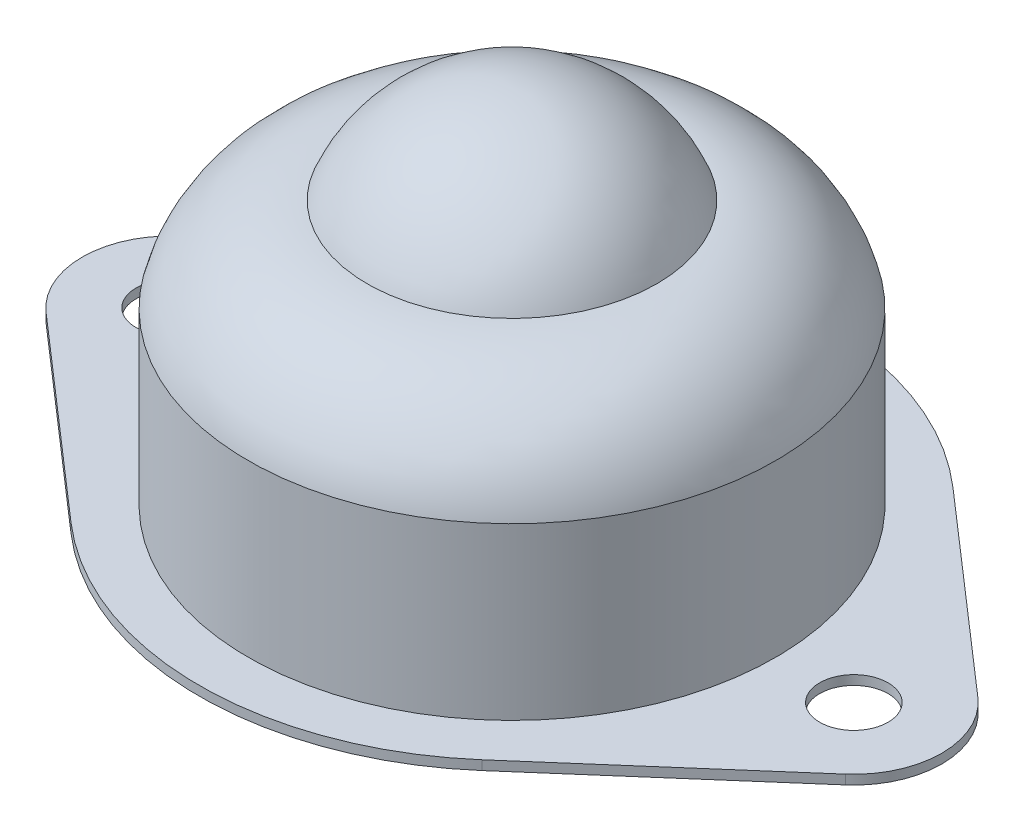
ISO-10303-21;
HEADER;
FILE_DESCRIPTION(('STEP AP214'),'2;1');
FILE_NAME('part.step','',(''),(''),'','','');
FILE_SCHEMA(('AUTOMOTIVE_DESIGN { 1 0 10303 214 1 1 1 1 }'));
ENDSEC;
DATA;
#1=APPLICATION_CONTEXT('core data for automotive mechanical design processes');
#2=APPLICATION_PROTOCOL_DEFINITION('international standard','automotive_design',2000,#1);
#3=PRODUCT_CONTEXT('',#1,'mechanical');
#4=PRODUCT('Part','Part','',(#3));
#5=PRODUCT_RELATED_PRODUCT_CATEGORY('part','',(#4));
#6=PRODUCT_DEFINITION_FORMATION('','',#4);
#7=PRODUCT_DEFINITION_CONTEXT('part definition',#1,'design');
#8=PRODUCT_DEFINITION('design','',#6,#7);
#9=PRODUCT_DEFINITION_SHAPE('','',#8);
#10=(LENGTH_UNIT() NAMED_UNIT(*) SI_UNIT(.MILLI.,.METRE.));
#11=(NAMED_UNIT(*) PLANE_ANGLE_UNIT() SI_UNIT($,.RADIAN.));
#12=(NAMED_UNIT(*) SI_UNIT($,.STERADIAN.) SOLID_ANGLE_UNIT());
#13=UNCERTAINTY_MEASURE_WITH_UNIT(LENGTH_MEASURE(1.E-05),#10,'distance_accuracy_value','');
#14=(GEOMETRIC_REPRESENTATION_CONTEXT(3) GLOBAL_UNCERTAINTY_ASSIGNED_CONTEXT((#13)) GLOBAL_UNIT_ASSIGNED_CONTEXT((#10,
#11,#12)) REPRESENTATION_CONTEXT('',''));
#15=CARTESIAN_POINT('',(0.,0.,0.));
#16=DIRECTION('',(0.,0.,1.));
#17=DIRECTION('',(1.,0.,0.));
#18=AXIS2_PLACEMENT_3D('',#15,#16,#17);
#19=CARTESIAN_POINT('',(0.,0.762,0.));
#20=DIRECTION('',(0.,-1.,0.));
#21=DIRECTION('',(0.,0.,-1.));
#22=AXIS2_PLACEMENT_3D('',#19,#20,#21);
#23=PLANE('',#22);
#24=CARTESIAN_POINT('',(0.,0.762,0.));
#25=DIRECTION('',(0.,-1.,0.));
#26=DIRECTION('',(0.,0.,-1.));
#27=AXIS2_PLACEMENT_3D('',#24,#25,#26);
#28=CIRCLE('',#27,21.43125);
#29=CARTESIAN_POINT('',(0.,0.762,-21.43125));
#30=VERTEX_POINT('',#29);
#31=EDGE_CURVE('E187',#30,#30,#28,.T.);
#32=ORIENTED_EDGE('',*,*,#31,.T.);
#33=EDGE_LOOP('',(#32));
#34=FACE_BOUND('',#33,.T.);
#35=CARTESIAN_POINT('',(-27.78125,0.762,0.));
#36=DIRECTION('',(0.,1.,0.));
#37=DIRECTION('',(0.,0.,1.));
#38=AXIS2_PLACEMENT_3D('',#35,#36,#37);
#39=CIRCLE('',#38,2.778125);
#40=CARTESIAN_POINT('',(-27.78125,0.762,-2.778125));
#41=VERTEX_POINT('',#40);
#42=EDGE_CURVE('E133',#41,#41,#39,.T.);
#43=ORIENTED_EDGE('',*,*,#42,.F.);
#44=EDGE_LOOP('',(#43));
#45=FACE_BOUND('',#44,.T.);
#46=CARTESIAN_POINT('',(0.,0.762,0.));
#47=DIRECTION('',(0.,1.,0.));
#48=DIRECTION('',(0.,0.,-1.));
#49=AXIS2_PLACEMENT_3D('',#46,#47,#48);
#50=CIRCLE('',#49,25.4);
#51=CARTESIAN_POINT('',(16.6914285714286,0.762,-19.1456577908647));
#52=VERTEX_POINT('',#51);
#53=CARTESIAN_POINT('',(-16.6914285714286,0.762,-19.1456577908647));
#54=VERTEX_POINT('',#53);
#55=EDGE_CURVE('E144',#52,#54,#50,.T.);
#56=ORIENTED_EDGE('',*,*,#55,.T.);
#57=DIRECTION('',(-0.753766054758452,0.,0.657142857142857));
#58=VECTOR('',#57,1.);
#59=CARTESIAN_POINT('',(-16.6914285714286,0.762,-19.1456577908647));
#60=LINE('',#59,#58);
#61=CARTESIAN_POINT('',(-32.4757142857143,0.762,-5.38471625368069));
#62=VERTEX_POINT('',#61);
#63=EDGE_CURVE('E92',#54,#62,#60,.T.);
#64=ORIENTED_EDGE('',*,*,#63,.T.);
#65=CARTESIAN_POINT('',(-27.78125,0.762,0.));
#66=DIRECTION('',(0.,1.,0.));
#67=DIRECTION('',(0.,0.,-1.));
#68=AXIS2_PLACEMENT_3D('',#65,#66,#67);
#69=CIRCLE('',#68,7.14375);
#70=CARTESIAN_POINT('',(-32.4757142857143,0.762,5.38471625368069));
#71=VERTEX_POINT('',#70);
#72=EDGE_CURVE('E159',#62,#71,#69,.T.);
#73=ORIENTED_EDGE('',*,*,#72,.T.);
#74=DIRECTION('',(0.753766054758453,0.,0.657142857142857));
#75=VECTOR('',#74,1.);
#76=CARTESIAN_POINT('',(-16.6914285714286,0.762,19.1456577908647));
#77=LINE('',#76,#75);
#78=CARTESIAN_POINT('',(-16.6914285714286,0.762,19.1456577908647));
#79=VERTEX_POINT('',#78);
#80=EDGE_CURVE('E172',#71,#79,#77,.T.);
#81=ORIENTED_EDGE('',*,*,#80,.T.);
#82=CARTESIAN_POINT('',(0.,0.762,0.));
#83=DIRECTION('',(0.,1.,0.));
#84=DIRECTION('',(0.,0.,1.));
#85=AXIS2_PLACEMENT_3D('',#82,#83,#84);
#86=CIRCLE('',#85,25.4);
#87=CARTESIAN_POINT('',(16.6914285714286,0.762,19.1456577908647));
#88=VERTEX_POINT('',#87);
#89=EDGE_CURVE('E111',#79,#88,#86,.T.);
#90=ORIENTED_EDGE('',*,*,#89,.T.);
#91=DIRECTION('',(0.753766054758453,0.,-0.657142857142857));
#92=VECTOR('',#91,1.);
#93=CARTESIAN_POINT('',(16.6914285714286,0.762,19.1456577908647));
#94=LINE('',#93,#92);
#95=CARTESIAN_POINT('',(32.4757142857143,0.762,5.38471625368069));
#96=VERTEX_POINT('',#95);
#97=EDGE_CURVE('E105',#88,#96,#94,.T.);
#98=ORIENTED_EDGE('',*,*,#97,.T.);
#99=CARTESIAN_POINT('',(27.78125,0.762,0.));
#100=DIRECTION('',(0.,1.,0.));
#101=DIRECTION('',(0.,0.,-1.));
#102=AXIS2_PLACEMENT_3D('',#99,#100,#101);
#103=CIRCLE('',#102,7.14375);
#104=CARTESIAN_POINT('',(32.4757142857143,0.762,-5.38471625368069));
#105=VERTEX_POINT('',#104);
#106=EDGE_CURVE('E109',#96,#105,#103,.T.);
#107=ORIENTED_EDGE('',*,*,#106,.T.);
#108=DIRECTION('',(-0.753766054758453,0.,-0.657142857142857));
#109=VECTOR('',#108,1.);
#110=CARTESIAN_POINT('',(16.6914285714286,0.762,-19.1456577908647));
#111=LINE('',#110,#109);
#112=EDGE_CURVE('E49',#105,#52,#111,.T.);
#113=ORIENTED_EDGE('',*,*,#112,.T.);
#114=EDGE_LOOP('',(#56,#64,#73,#81,#90,#98,#107,#113));
#115=FACE_BOUND('',#114,.T.);
#116=CARTESIAN_POINT('',(27.78125,0.762,0.));
#117=DIRECTION('',(0.,1.,0.));
#118=DIRECTION('',(0.,0.,1.));
#119=AXIS2_PLACEMENT_3D('',#116,#117,#118);
#120=CIRCLE('',#119,2.778125);
#121=CARTESIAN_POINT('',(27.78125,0.762,-2.778125));
#122=VERTEX_POINT('',#121);
#123=EDGE_CURVE('E181',#122,#122,#120,.T.);
#124=ORIENTED_EDGE('',*,*,#123,.F.);
#125=EDGE_LOOP('',(#124));
#126=FACE_BOUND('',#125,.T.);
#127=ADVANCED_FACE('F32',(#34,#45,#115,#126),#23,.F.);
#128=CARTESIAN_POINT('',(0.,0.,0.));
#129=DIRECTION('',(0.,-1.,0.));
#130=DIRECTION('',(0.,0.,-1.));
#131=AXIS2_PLACEMENT_3D('',#128,#129,#130);
#132=PLANE('',#131);
#133=CARTESIAN_POINT('',(-27.78125,0.,0.));
#134=DIRECTION('',(0.,1.,0.));
#135=DIRECTION('',(0.,0.,1.));
#136=AXIS2_PLACEMENT_3D('',#133,#134,#135);
#137=CIRCLE('',#136,2.778125);
#138=CARTESIAN_POINT('',(-27.78125,0.,-2.778125));
#139=VERTEX_POINT('',#138);
#140=EDGE_CURVE('E178',#139,#139,#137,.T.);
#141=ORIENTED_EDGE('',*,*,#140,.T.);
#142=EDGE_LOOP('',(#141));
#143=FACE_BOUND('',#142,.T.);
#144=CARTESIAN_POINT('',(0.,0.,0.));
#145=DIRECTION('',(0.,1.,0.));
#146=DIRECTION('',(0.,0.,-1.));
#147=AXIS2_PLACEMENT_3D('',#144,#145,#146);
#148=CIRCLE('',#147,25.4);
#149=CARTESIAN_POINT('',(16.6914285714286,0.,-19.1456577908647));
#150=VERTEX_POINT('',#149);
#151=CARTESIAN_POINT('',(-16.6914285714286,0.,-19.1456577908647));
#152=VERTEX_POINT('',#151);
#153=EDGE_CURVE('E129',#150,#152,#148,.T.);
#154=ORIENTED_EDGE('',*,*,#153,.F.);
#155=DIRECTION('',(-0.753766054758453,0.,-0.657142857142857));
#156=VECTOR('',#155,1.);
#157=CARTESIAN_POINT('',(16.6914285714286,0.,-19.1456577908647));
#158=LINE('',#157,#156);
#159=CARTESIAN_POINT('',(32.4757142857143,0.,-5.38471625368069));
#160=VERTEX_POINT('',#159);
#161=EDGE_CURVE('E84',#160,#150,#158,.T.);
#162=ORIENTED_EDGE('',*,*,#161,.F.);
#163=CARTESIAN_POINT('',(27.78125,0.,0.));
#164=DIRECTION('',(0.,1.,0.));
#165=DIRECTION('',(0.,0.,-1.));
#166=AXIS2_PLACEMENT_3D('',#163,#164,#165);
#167=CIRCLE('',#166,7.14375);
#168=CARTESIAN_POINT('',(32.4757142857143,0.,5.38471625368069));
#169=VERTEX_POINT('',#168);
#170=EDGE_CURVE('E78',#169,#160,#167,.T.);
#171=ORIENTED_EDGE('',*,*,#170,.F.);
#172=DIRECTION('',(0.753766054758453,0.,-0.657142857142857));
#173=VECTOR('',#172,1.);
#174=CARTESIAN_POINT('',(16.6914285714286,0.,19.1456577908647));
#175=LINE('',#174,#173);
#176=CARTESIAN_POINT('',(16.6914285714286,0.,19.1456577908647));
#177=VERTEX_POINT('',#176);
#178=EDGE_CURVE('E119',#177,#169,#175,.T.);
#179=ORIENTED_EDGE('',*,*,#178,.F.);
#180=CARTESIAN_POINT('',(0.,0.,0.));
#181=DIRECTION('',(0.,1.,0.));
#182=DIRECTION('',(0.,0.,1.));
#183=AXIS2_PLACEMENT_3D('',#180,#181,#182);
#184=CIRCLE('',#183,25.4);
#185=CARTESIAN_POINT('',(-16.6914285714286,0.,19.1456577908647));
#186=VERTEX_POINT('',#185);
#187=EDGE_CURVE('E139',#186,#177,#184,.T.);
#188=ORIENTED_EDGE('',*,*,#187,.F.);
#189=DIRECTION('',(0.753766054758453,0.,0.657142857142857));
#190=VECTOR('',#189,1.);
#191=CARTESIAN_POINT('',(-16.6914285714286,0.,19.1456577908647));
#192=LINE('',#191,#190);
#193=CARTESIAN_POINT('',(-32.4757142857143,0.,5.38471625368069));
#194=VERTEX_POINT('',#193);
#195=EDGE_CURVE('E137',#194,#186,#192,.T.);
#196=ORIENTED_EDGE('',*,*,#195,.F.);
#197=CARTESIAN_POINT('',(-27.78125,0.,0.));
#198=DIRECTION('',(0.,1.,0.));
#199=DIRECTION('',(0.,0.,-1.));
#200=AXIS2_PLACEMENT_3D('',#197,#198,#199);
#201=CIRCLE('',#200,7.14375);
#202=CARTESIAN_POINT('',(-32.4757142857143,0.,-5.38471625368069));
#203=VERTEX_POINT('',#202);
#204=EDGE_CURVE('E135',#203,#194,#201,.T.);
#205=ORIENTED_EDGE('',*,*,#204,.F.);
#206=DIRECTION('',(-0.753766054758452,0.,0.657142857142857));
#207=VECTOR('',#206,1.);
#208=CARTESIAN_POINT('',(-16.6914285714286,0.,-19.1456577908647));
#209=LINE('',#208,#207);
#210=EDGE_CURVE('E132',#152,#203,#209,.T.);
#211=ORIENTED_EDGE('',*,*,#210,.F.);
#212=EDGE_LOOP('',(#154,#162,#171,#179,#188,#196,#205,#211));
#213=FACE_BOUND('',#212,.T.);
#214=CARTESIAN_POINT('',(27.78125,0.,0.));
#215=DIRECTION('',(0.,1.,0.));
#216=DIRECTION('',(0.,0.,1.));
#217=AXIS2_PLACEMENT_3D('',#214,#215,#216);
#218=CIRCLE('',#217,2.778125);
#219=CARTESIAN_POINT('',(27.78125,0.,-2.778125));
#220=VERTEX_POINT('',#219);
#221=EDGE_CURVE('E184',#220,#220,#218,.T.);
#222=ORIENTED_EDGE('',*,*,#221,.T.);
#223=EDGE_LOOP('',(#222));
#224=FACE_BOUND('',#223,.T.);
#225=ADVANCED_FACE('F163',(#143,#213,#224),#132,.T.);
#226=CARTESIAN_POINT('',(0.,0.762,0.));
#227=DIRECTION('',(0.,-1.,0.));
#228=DIRECTION('',(0.,0.,-1.));
#229=AXIS2_PLACEMENT_3D('',#226,#227,#228);
#230=CYLINDRICAL_SURFACE('',#229,25.4);
#231=ORIENTED_EDGE('',*,*,#153,.T.);
#232=DIRECTION('',(0.,-1.,0.));
#233=VECTOR('',#232,1.);
#234=CARTESIAN_POINT('',(-16.6914285714286,0.762,-19.1456577908647));
#235=LINE('',#234,#233);
#236=EDGE_CURVE('E11',#54,#152,#235,.T.);
#237=ORIENTED_EDGE('',*,*,#236,.F.);
#238=ORIENTED_EDGE('',*,*,#55,.F.);
#239=DIRECTION('',(0.,-1.,0.));
#240=VECTOR('',#239,1.);
#241=CARTESIAN_POINT('',(16.6914285714286,0.762,-19.1456577908647));
#242=LINE('',#241,#240);
#243=EDGE_CURVE('E125',#52,#150,#242,.T.);
#244=ORIENTED_EDGE('',*,*,#243,.T.);
#245=EDGE_LOOP('',(#231,#237,#238,#244));
#246=FACE_BOUND('',#245,.T.);
#247=ADVANCED_FACE('F34',(#246),#230,.T.);
#248=CARTESIAN_POINT('',(-16.6914285714286,0.762,-19.1456577908647));
#249=DIRECTION('',(0.657142857142857,0.,0.753766054758452));
#250=DIRECTION('',(0.753766054758452,0.,-0.657142857142858));
#251=AXIS2_PLACEMENT_3D('',#248,#249,#250);
#252=PLANE('',#251);
#253=ORIENTED_EDGE('',*,*,#210,.T.);
#254=DIRECTION('',(0.,-1.,0.));
#255=VECTOR('',#254,1.);
#256=CARTESIAN_POINT('',(-32.4757142857143,0.762,-5.38471625368069));
#257=LINE('',#256,#255);
#258=EDGE_CURVE('E41',#62,#203,#257,.T.);
#259=ORIENTED_EDGE('',*,*,#258,.F.);
#260=ORIENTED_EDGE('',*,*,#63,.F.);
#261=ORIENTED_EDGE('',*,*,#236,.T.);
#262=EDGE_LOOP('',(#253,#259,#260,#261));
#263=FACE_BOUND('',#262,.T.);
#264=ADVANCED_FACE('F238',(#263),#252,.F.);
#265=CARTESIAN_POINT('',(-27.78125,0.762,0.));
#266=DIRECTION('',(0.,-1.,0.));
#267=DIRECTION('',(0.,0.,-1.));
#268=AXIS2_PLACEMENT_3D('',#265,#266,#267);
#269=CYLINDRICAL_SURFACE('',#268,7.14375);
#270=ORIENTED_EDGE('',*,*,#204,.T.);
#271=DIRECTION('',(0.,-1.,0.));
#272=VECTOR('',#271,1.);
#273=CARTESIAN_POINT('',(-32.4757142857143,0.762,5.38471625368069));
#274=LINE('',#273,#272);
#275=EDGE_CURVE('E151',#71,#194,#274,.T.);
#276=ORIENTED_EDGE('',*,*,#275,.F.);
#277=ORIENTED_EDGE('',*,*,#72,.F.);
#278=ORIENTED_EDGE('',*,*,#258,.T.);
#279=EDGE_LOOP('',(#270,#276,#277,#278));
#280=FACE_BOUND('',#279,.T.);
#281=ADVANCED_FACE('F157',(#280),#269,.T.);
#282=CARTESIAN_POINT('',(-16.6914285714286,0.762,19.1456577908647));
#283=DIRECTION('',(0.657142857142857,0.,-0.753766054758453));
#284=DIRECTION('',(-0.753766054758453,0.,-0.657142857142857));
#285=AXIS2_PLACEMENT_3D('',#282,#283,#284);
#286=PLANE('',#285);
#287=ORIENTED_EDGE('',*,*,#195,.T.);
#288=DIRECTION('',(0.,-1.,0.));
#289=VECTOR('',#288,1.);
#290=CARTESIAN_POINT('',(-16.6914285714286,0.762,19.1456577908647));
#291=LINE('',#290,#289);
#292=EDGE_CURVE('E148',#79,#186,#291,.T.);
#293=ORIENTED_EDGE('',*,*,#292,.F.);
#294=ORIENTED_EDGE('',*,*,#80,.F.);
#295=ORIENTED_EDGE('',*,*,#275,.T.);
#296=EDGE_LOOP('',(#287,#293,#294,#295));
#297=FACE_BOUND('',#296,.T.);
#298=ADVANCED_FACE('F168',(#297),#286,.F.);
#299=CARTESIAN_POINT('',(0.,0.762,0.));
#300=DIRECTION('',(0.,-1.,0.));
#301=DIRECTION('',(0.,0.,-1.));
#302=AXIS2_PLACEMENT_3D('',#299,#300,#301);
#303=CYLINDRICAL_SURFACE('',#302,25.4);
#304=ORIENTED_EDGE('',*,*,#187,.T.);
#305=DIRECTION('',(0.,-1.,0.));
#306=VECTOR('',#305,1.);
#307=CARTESIAN_POINT('',(16.6914285714286,0.762,19.1456577908647));
#308=LINE('',#307,#306);
#309=EDGE_CURVE('E120',#88,#177,#308,.T.);
#310=ORIENTED_EDGE('',*,*,#309,.F.);
#311=ORIENTED_EDGE('',*,*,#89,.F.);
#312=ORIENTED_EDGE('',*,*,#292,.T.);
#313=EDGE_LOOP('',(#304,#310,#311,#312));
#314=FACE_BOUND('',#313,.T.);
#315=ADVANCED_FACE('F171',(#314),#303,.T.);
#316=CARTESIAN_POINT('',(16.6914285714286,0.762,19.1456577908647));
#317=DIRECTION('',(-0.657142857142857,0.,-0.753766054758453));
#318=DIRECTION('',(-0.753766054758453,0.,0.657142857142857));
#319=AXIS2_PLACEMENT_3D('',#316,#317,#318);
#320=PLANE('',#319);
#321=ORIENTED_EDGE('',*,*,#178,.T.);
#322=DIRECTION('',(0.,-1.,0.));
#323=VECTOR('',#322,1.);
#324=CARTESIAN_POINT('',(32.4757142857143,0.762,5.38471625368069));
#325=LINE('',#324,#323);
#326=EDGE_CURVE('E116',#96,#169,#325,.T.);
#327=ORIENTED_EDGE('',*,*,#326,.F.);
#328=ORIENTED_EDGE('',*,*,#97,.F.);
#329=ORIENTED_EDGE('',*,*,#309,.T.);
#330=EDGE_LOOP('',(#321,#327,#328,#329));
#331=FACE_BOUND('',#330,.T.);
#332=ADVANCED_FACE('F117',(#331),#320,.F.);
#333=CARTESIAN_POINT('',(27.78125,0.762,0.));
#334=DIRECTION('',(0.,-1.,0.));
#335=DIRECTION('',(0.,0.,-1.));
#336=AXIS2_PLACEMENT_3D('',#333,#334,#335);
#337=CYLINDRICAL_SURFACE('',#336,7.14375);
#338=ORIENTED_EDGE('',*,*,#170,.T.);
#339=DIRECTION('',(0.,-1.,0.));
#340=VECTOR('',#339,1.);
#341=CARTESIAN_POINT('',(32.4757142857143,0.762,-5.38471625368069));
#342=LINE('',#341,#340);
#343=EDGE_CURVE('E121',#105,#160,#342,.T.);
#344=ORIENTED_EDGE('',*,*,#343,.F.);
#345=ORIENTED_EDGE('',*,*,#106,.F.);
#346=ORIENTED_EDGE('',*,*,#326,.T.);
#347=EDGE_LOOP('',(#338,#344,#345,#346));
#348=FACE_BOUND('',#347,.T.);
#349=ADVANCED_FACE('F123',(#348),#337,.T.);
#350=CARTESIAN_POINT('',(16.6914285714286,0.762,-19.1456577908647));
#351=DIRECTION('',(-0.657142857142857,0.,0.753766054758453));
#352=DIRECTION('',(0.753766054758453,0.,0.657142857142857));
#353=AXIS2_PLACEMENT_3D('',#350,#351,#352);
#354=PLANE('',#353);
#355=ORIENTED_EDGE('',*,*,#161,.T.);
#356=ORIENTED_EDGE('',*,*,#243,.F.);
#357=ORIENTED_EDGE('',*,*,#112,.F.);
#358=ORIENTED_EDGE('',*,*,#343,.T.);
#359=EDGE_LOOP('',(#355,#356,#357,#358));
#360=FACE_BOUND('',#359,.T.);
#361=ADVANCED_FACE('F226',(#360),#354,.F.);
#362=CARTESIAN_POINT('',(-27.78125,0.762,0.));
#363=DIRECTION('',(0.,-1.,0.));
#364=DIRECTION('',(0.,0.,-1.));
#365=AXIS2_PLACEMENT_3D('',#362,#363,#364);
#366=CYLINDRICAL_SURFACE('',#365,2.778125);
#367=CARTESIAN_POINT('',(-27.78125,0.762,-2.778125));
#368=CARTESIAN_POINT('',(-27.78125,0.7540625,-2.778125));
#369=CARTESIAN_POINT('',(-27.78125,0.746125,-2.778125));
#370=CARTESIAN_POINT('',(-27.78125,0.73025,-2.778125));
#371=CARTESIAN_POINT('',(-27.78125,0.7223125,-2.778125));
#372=CARTESIAN_POINT('',(-27.78125,0.7064375,-2.778125));
#373=CARTESIAN_POINT('',(-27.78125,0.6985,-2.778125));
#374=CARTESIAN_POINT('',(-27.78125,0.682625,-2.778125));
#375=CARTESIAN_POINT('',(-27.78125,0.6746875,-2.778125));
#376=CARTESIAN_POINT('',(-27.78125,0.6588125,-2.778125));
#377=CARTESIAN_POINT('',(-27.78125,0.650875,-2.778125));
#378=CARTESIAN_POINT('',(-27.78125,0.635,-2.778125));
#379=CARTESIAN_POINT('',(-27.78125,0.6270625,-2.778125));
#380=CARTESIAN_POINT('',(-27.78125,0.6111875,-2.778125));
#381=CARTESIAN_POINT('',(-27.78125,0.60325,-2.778125));
#382=CARTESIAN_POINT('',(-27.78125,0.587375,-2.778125));
#383=CARTESIAN_POINT('',(-27.78125,0.5794375,-2.778125));
#384=CARTESIAN_POINT('',(-27.78125,0.5635625,-2.778125));
#385=CARTESIAN_POINT('',(-27.78125,0.555625,-2.778125));
#386=CARTESIAN_POINT('',(-27.78125,0.53975,-2.778125));
#387=CARTESIAN_POINT('',(-27.78125,0.5318125,-2.778125));
#388=CARTESIAN_POINT('',(-27.78125,0.5159375,-2.778125));
#389=CARTESIAN_POINT('',(-27.78125,0.508,-2.778125));
#390=CARTESIAN_POINT('',(-27.78125,0.492125,-2.778125));
#391=CARTESIAN_POINT('',(-27.78125,0.4841875,-2.778125));
#392=CARTESIAN_POINT('',(-27.78125,0.4683125,-2.778125));
#393=CARTESIAN_POINT('',(-27.78125,0.460375,-2.778125));
#394=CARTESIAN_POINT('',(-27.78125,0.4445,-2.778125));
#395=CARTESIAN_POINT('',(-27.78125,0.4365625,-2.778125));
#396=CARTESIAN_POINT('',(-27.78125,0.4206875,-2.778125));
#397=CARTESIAN_POINT('',(-27.78125,0.41275,-2.778125));
#398=CARTESIAN_POINT('',(-27.78125,0.396875,-2.778125));
#399=CARTESIAN_POINT('',(-27.78125,0.3889375,-2.778125));
#400=CARTESIAN_POINT('',(-27.78125,0.3730625,-2.778125));
#401=CARTESIAN_POINT('',(-27.78125,0.365125,-2.778125));
#402=CARTESIAN_POINT('',(-27.78125,0.34925,-2.778125));
#403=CARTESIAN_POINT('',(-27.78125,0.3413125,-2.778125));
#404=CARTESIAN_POINT('',(-27.78125,0.3254375,-2.778125));
#405=CARTESIAN_POINT('',(-27.78125,0.3175,-2.778125));
#406=CARTESIAN_POINT('',(-27.78125,0.301625,-2.778125));
#407=CARTESIAN_POINT('',(-27.78125,0.2936875,-2.778125));
#408=CARTESIAN_POINT('',(-27.78125,0.2778125,-2.778125));
#409=CARTESIAN_POINT('',(-27.78125,0.269875,-2.778125));
#410=CARTESIAN_POINT('',(-27.78125,0.254,-2.778125));
#411=CARTESIAN_POINT('',(-27.78125,0.2460625,-2.778125));
#412=CARTESIAN_POINT('',(-27.78125,0.2301875,-2.778125));
#413=CARTESIAN_POINT('',(-27.78125,0.22225,-2.778125));
#414=CARTESIAN_POINT('',(-27.78125,0.206375,-2.778125));
#415=CARTESIAN_POINT('',(-27.78125,0.1984375,-2.778125));
#416=CARTESIAN_POINT('',(-27.78125,0.1825625,-2.778125));
#417=CARTESIAN_POINT('',(-27.78125,0.174625,-2.778125));
#418=CARTESIAN_POINT('',(-27.78125,0.15875,-2.778125));
#419=CARTESIAN_POINT('',(-27.78125,0.1508125,-2.778125));
#420=CARTESIAN_POINT('',(-27.78125,0.1349375,-2.778125));
#421=CARTESIAN_POINT('',(-27.78125,0.127,-2.778125));
#422=CARTESIAN_POINT('',(-27.78125,0.111125,-2.778125));
#423=CARTESIAN_POINT('',(-27.78125,0.1031875,-2.778125));
#424=CARTESIAN_POINT('',(-27.78125,0.0873125,-2.778125));
#425=CARTESIAN_POINT('',(-27.78125,0.079375,-2.778125));
#426=CARTESIAN_POINT('',(-27.78125,0.0635,-2.778125));
#427=CARTESIAN_POINT('',(-27.78125,0.0555625,-2.778125));
#428=CARTESIAN_POINT('',(-27.78125,0.0396875,-2.778125));
#429=CARTESIAN_POINT('',(-27.78125,0.03175,-2.778125));
#430=CARTESIAN_POINT('',(-27.78125,0.015875,-2.778125));
#431=CARTESIAN_POINT('',(-27.78125,0.00793749999999999,-2.778125));
#432=CARTESIAN_POINT('',(-27.78125,0.,-2.778125));
#433=B_SPLINE_CURVE_WITH_KNOTS('',3,(#367,#368,#369,#370,#371,#372,#373,#374,#375,#376,#377,
#378,#379,#380,#381,#382,#383,#384,#385,#386,#387,#388,#389,#390,#391,#392,#393,#394,#395,#396,
#397,#398,#399,#400,#401,#402,#403,#404,#405,#406,#407,#408,#409,#410,#411,#412,#413,#414,#415,
#416,#417,#418,#419,#420,#421,#422,#423,#424,#425,#426,#427,#428,#429,#430,#431,#432),
.UNSPECIFIED.,.F.,.F.,(4,2,2,2,2,2,2,2,2,2,2,2,2,2,2,2,2,2,2,2,2,2,2,2,2,2,2,2,2,2,2,2,4),(0.,
0.0238125,0.0476249999999999,0.0714374999999999,0.09525,0.1190625,0.142875,0.1666875,0.1905,
0.2143125,0.238125,0.2619375,0.28575,0.3095625,0.333375,0.3571875,0.381,0.4048125,0.428625,
0.4524375,0.47625,0.5000625,0.523875,0.5476875,0.5715,0.5953125,0.619125,0.6429375,0.66675,
0.6905625,0.714375,0.7381875,0.762),.UNSPECIFIED.);
#434=EDGE_CURVE('BSEAM223',#41,#139,#433,.T.);
#435=ORIENTED_EDGE('',*,*,#42,.T.);
#436=ORIENTED_EDGE('',*,*,#140,.F.);
#437=ORIENTED_EDGE('',*,*,#434,.T.);
#438=ORIENTED_EDGE('',*,*,#434,.F.);
#439=EDGE_LOOP('',(#435,#437,#436,#438));
#440=FACE_BOUND('',#439,.T.);
#441=ADVANCED_FACE('F223',(#440),#366,.F.);
#442=CARTESIAN_POINT('',(27.78125,0.762,0.));
#443=DIRECTION('',(0.,-1.,0.));
#444=DIRECTION('',(0.,0.,-1.));
#445=AXIS2_PLACEMENT_3D('',#442,#443,#444);
#446=CYLINDRICAL_SURFACE('',#445,2.778125);
#447=CARTESIAN_POINT('',(27.78125,0.762,-2.778125));
#448=CARTESIAN_POINT('',(27.78125,0.7540625,-2.778125));
#449=CARTESIAN_POINT('',(27.78125,0.746125,-2.778125));
#450=CARTESIAN_POINT('',(27.78125,0.73025,-2.778125));
#451=CARTESIAN_POINT('',(27.78125,0.7223125,-2.778125));
#452=CARTESIAN_POINT('',(27.78125,0.7064375,-2.778125));
#453=CARTESIAN_POINT('',(27.78125,0.6985,-2.778125));
#454=CARTESIAN_POINT('',(27.78125,0.682625,-2.778125));
#455=CARTESIAN_POINT('',(27.78125,0.6746875,-2.778125));
#456=CARTESIAN_POINT('',(27.78125,0.6588125,-2.778125));
#457=CARTESIAN_POINT('',(27.78125,0.650875,-2.778125));
#458=CARTESIAN_POINT('',(27.78125,0.635,-2.778125));
#459=CARTESIAN_POINT('',(27.78125,0.6270625,-2.778125));
#460=CARTESIAN_POINT('',(27.78125,0.6111875,-2.778125));
#461=CARTESIAN_POINT('',(27.78125,0.60325,-2.778125));
#462=CARTESIAN_POINT('',(27.78125,0.587375,-2.778125));
#463=CARTESIAN_POINT('',(27.78125,0.5794375,-2.778125));
#464=CARTESIAN_POINT('',(27.78125,0.5635625,-2.778125));
#465=CARTESIAN_POINT('',(27.78125,0.555625,-2.778125));
#466=CARTESIAN_POINT('',(27.78125,0.53975,-2.778125));
#467=CARTESIAN_POINT('',(27.78125,0.5318125,-2.778125));
#468=CARTESIAN_POINT('',(27.78125,0.5159375,-2.778125));
#469=CARTESIAN_POINT('',(27.78125,0.508,-2.778125));
#470=CARTESIAN_POINT('',(27.78125,0.492125,-2.778125));
#471=CARTESIAN_POINT('',(27.78125,0.4841875,-2.778125));
#472=CARTESIAN_POINT('',(27.78125,0.4683125,-2.778125));
#473=CARTESIAN_POINT('',(27.78125,0.460375,-2.778125));
#474=CARTESIAN_POINT('',(27.78125,0.4445,-2.778125));
#475=CARTESIAN_POINT('',(27.78125,0.4365625,-2.778125));
#476=CARTESIAN_POINT('',(27.78125,0.4206875,-2.778125));
#477=CARTESIAN_POINT('',(27.78125,0.41275,-2.778125));
#478=CARTESIAN_POINT('',(27.78125,0.396875,-2.778125));
#479=CARTESIAN_POINT('',(27.78125,0.3889375,-2.778125));
#480=CARTESIAN_POINT('',(27.78125,0.3730625,-2.778125));
#481=CARTESIAN_POINT('',(27.78125,0.365125,-2.778125));
#482=CARTESIAN_POINT('',(27.78125,0.34925,-2.778125));
#483=CARTESIAN_POINT('',(27.78125,0.3413125,-2.778125));
#484=CARTESIAN_POINT('',(27.78125,0.3254375,-2.778125));
#485=CARTESIAN_POINT('',(27.78125,0.3175,-2.778125));
#486=CARTESIAN_POINT('',(27.78125,0.301625,-2.778125));
#487=CARTESIAN_POINT('',(27.78125,0.2936875,-2.778125));
#488=CARTESIAN_POINT('',(27.78125,0.2778125,-2.778125));
#489=CARTESIAN_POINT('',(27.78125,0.269875,-2.778125));
#490=CARTESIAN_POINT('',(27.78125,0.254,-2.778125));
#491=CARTESIAN_POINT('',(27.78125,0.2460625,-2.778125));
#492=CARTESIAN_POINT('',(27.78125,0.2301875,-2.778125));
#493=CARTESIAN_POINT('',(27.78125,0.22225,-2.778125));
#494=CARTESIAN_POINT('',(27.78125,0.206375,-2.778125));
#495=CARTESIAN_POINT('',(27.78125,0.1984375,-2.778125));
#496=CARTESIAN_POINT('',(27.78125,0.1825625,-2.778125));
#497=CARTESIAN_POINT('',(27.78125,0.174625,-2.778125));
#498=CARTESIAN_POINT('',(27.78125,0.15875,-2.778125));
#499=CARTESIAN_POINT('',(27.78125,0.1508125,-2.778125));
#500=CARTESIAN_POINT('',(27.78125,0.1349375,-2.778125));
#501=CARTESIAN_POINT('',(27.78125,0.127,-2.778125));
#502=CARTESIAN_POINT('',(27.78125,0.111125,-2.778125));
#503=CARTESIAN_POINT('',(27.78125,0.1031875,-2.778125));
#504=CARTESIAN_POINT('',(27.78125,0.0873125,-2.778125));
#505=CARTESIAN_POINT('',(27.78125,0.079375,-2.778125));
#506=CARTESIAN_POINT('',(27.78125,0.0635,-2.778125));
#507=CARTESIAN_POINT('',(27.78125,0.0555625,-2.778125));
#508=CARTESIAN_POINT('',(27.78125,0.0396875,-2.778125));
#509=CARTESIAN_POINT('',(27.78125,0.03175,-2.778125));
#510=CARTESIAN_POINT('',(27.78125,0.015875,-2.778125));
#511=CARTESIAN_POINT('',(27.78125,0.00793749999999999,-2.778125));
#512=CARTESIAN_POINT('',(27.78125,0.,-2.778125));
#513=B_SPLINE_CURVE_WITH_KNOTS('',3,(#447,#448,#449,#450,#451,#452,#453,#454,#455,#456,#457,
#458,#459,#460,#461,#462,#463,#464,#465,#466,#467,#468,#469,#470,#471,#472,#473,#474,#475,#476,
#477,#478,#479,#480,#481,#482,#483,#484,#485,#486,#487,#488,#489,#490,#491,#492,#493,#494,#495,
#496,#497,#498,#499,#500,#501,#502,#503,#504,#505,#506,#507,#508,#509,#510,#511,#512),
.UNSPECIFIED.,.F.,.F.,(4,2,2,2,2,2,2,2,2,2,2,2,2,2,2,2,2,2,2,2,2,2,2,2,2,2,2,2,2,2,2,2,4),(0.,
0.0238125,0.0476249999999999,0.0714374999999999,0.09525,0.1190625,0.142875,0.1666875,0.1905,
0.2143125,0.238125,0.2619375,0.28575,0.3095625,0.333375,0.3571875,0.381,0.4048125,0.428625,
0.4524375,0.47625,0.5000625,0.523875,0.5476875,0.5715,0.5953125,0.619125,0.6429375,0.66675,
0.6905625,0.714375,0.7381875,0.762),.UNSPECIFIED.);
#514=EDGE_CURVE('BSEAM264',#122,#220,#513,.T.);
#515=ORIENTED_EDGE('',*,*,#123,.T.);
#516=ORIENTED_EDGE('',*,*,#221,.F.);
#517=ORIENTED_EDGE('',*,*,#514,.T.);
#518=ORIENTED_EDGE('',*,*,#514,.F.);
#519=EDGE_LOOP('',(#515,#517,#516,#518));
#520=FACE_BOUND('',#519,.T.);
#521=ADVANCED_FACE('F264',(#520),#446,.F.);
#522=CARTESIAN_POINT('',(0.,0.,0.));
#523=DIRECTION('',(0.,-1.,0.));
#524=DIRECTION('',(0.,0.,-1.));
#525=AXIS2_PLACEMENT_3D('',#522,#523,#524);
#526=CYLINDRICAL_SURFACE('',#525,21.43125);
#527=CARTESIAN_POINT('',(0.,14.605,0.));
#528=DIRECTION('',(0.,-1.,0.));
#529=DIRECTION('',(0.,0.,-1.));
#530=AXIS2_PLACEMENT_3D('',#527,#528,#529);
#531=CIRCLE('',#530,21.43125);
#532=CARTESIAN_POINT('',(0.,14.605,-21.43125));
#533=VERTEX_POINT('',#532);
#534=EDGE_CURVE('E195',#533,#533,#531,.T.);
#535=ORIENTED_EDGE('',*,*,#534,.T.);
#536=EDGE_LOOP('',(#535));
#537=FACE_BOUND('',#536,.T.);
#538=ORIENTED_EDGE('',*,*,#31,.F.);
#539=EDGE_LOOP('',(#538));
#540=FACE_BOUND('',#539,.T.);
#541=ADVANCED_FACE('F199',(#537,#540),#526,.T.);
#542=CARTESIAN_POINT('',(0.,17.4625,0.));
#543=DIRECTION('',(0.,-1.,0.));
#544=DIRECTION('',(1.,0.,0.));
#545=AXIS2_PLACEMENT_3D('',#542,#543,#544);
#546=SPHERICAL_SURFACE('',#545,12.7);
#547=CARTESIAN_POINT('',(0.,22.225,0.));
#548=DIRECTION('',(0.,-1.,0.));
#549=DIRECTION('',(0.,0.,-1.));
#550=AXIS2_PLACEMENT_3D('',#547,#548,#549);
#551=CIRCLE('',#550,11.7732150982644);
#552=CARTESIAN_POINT('',(0.,22.225,-11.7732150982644));
#553=VERTEX_POINT('',#552);
#554=EDGE_CURVE('E192',#553,#553,#551,.T.);
#555=ORIENTED_EDGE('',*,*,#554,.F.);
#556=EDGE_LOOP('',(#555));
#557=FACE_BOUND('',#556,.T.);
#558=ADVANCED_FACE('F204',(#557),#546,.T.);
#559=CARTESIAN_POINT('',(0.,12.2944200680352,0.));
#560=DIRECTION('',(0.,-1.,0.));
#561=DIRECTION('',(0.,0.,-1.));
#562=AXIS2_PLACEMENT_3D('',#559,#560,#561);
#563=TOROIDAL_SURFACE('',#562,11.7732150982644,9.93057993196481);
#564=ORIENTED_EDGE('',*,*,#554,.T.);
#565=EDGE_LOOP('',(#564));
#566=FACE_BOUND('',#565,.T.);
#567=ORIENTED_EDGE('',*,*,#534,.F.);
#568=EDGE_LOOP('',(#567));
#569=FACE_BOUND('',#568,.T.);
#570=ADVANCED_FACE('F202',(#566,#569),#563,.T.);
#571=CLOSED_SHELL('',(#127,#225,#247,#264,#281,#298,#315,#332,#349,#361,#441,#521,#541,#558,#570));
#572=MANIFOLD_SOLID_BREP('B2',#571);
#573=ADVANCED_BREP_SHAPE_REPRESENTATION('',(#18,#572),#14);
#574=SHAPE_DEFINITION_REPRESENTATION(#9,#573);
ENDSEC;
END-ISO-10303-21;
